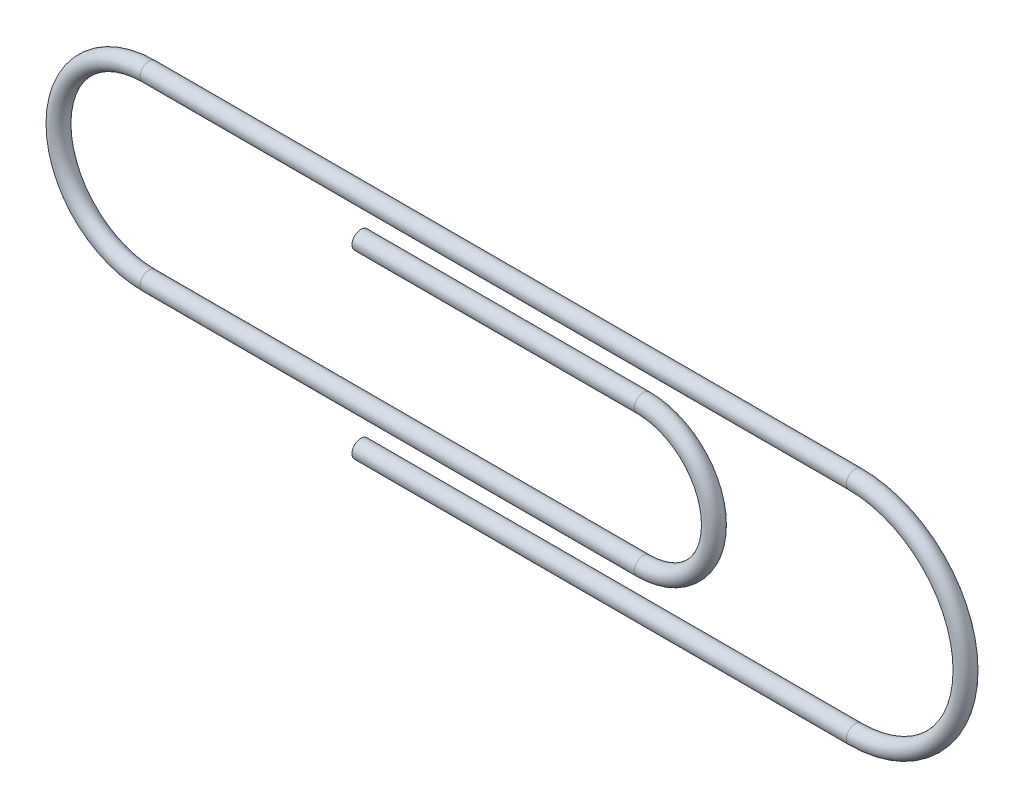
ISO-10303-21;
HEADER;
FILE_DESCRIPTION(('STEP AP214'),'2;1');
FILE_NAME('part.step','',(''),(''),'','','');
FILE_SCHEMA(('AUTOMOTIVE_DESIGN { 1 0 10303 214 1 1 1 1 }'));
ENDSEC;
DATA;
#1=APPLICATION_CONTEXT('core data for automotive mechanical design processes');
#2=APPLICATION_PROTOCOL_DEFINITION('international standard','automotive_design',2000,#1);
#3=PRODUCT_CONTEXT('',#1,'mechanical');
#4=PRODUCT('Part','Part','',(#3));
#5=PRODUCT_RELATED_PRODUCT_CATEGORY('part','',(#4));
#6=PRODUCT_DEFINITION_FORMATION('','',#4);
#7=PRODUCT_DEFINITION_CONTEXT('part definition',#1,'design');
#8=PRODUCT_DEFINITION('design','',#6,#7);
#9=PRODUCT_DEFINITION_SHAPE('','',#8);
#10=(LENGTH_UNIT() NAMED_UNIT(*) SI_UNIT(.MILLI.,.METRE.));
#11=(NAMED_UNIT(*) PLANE_ANGLE_UNIT() SI_UNIT($,.RADIAN.));
#12=(NAMED_UNIT(*) SI_UNIT($,.STERADIAN.) SOLID_ANGLE_UNIT());
#13=UNCERTAINTY_MEASURE_WITH_UNIT(LENGTH_MEASURE(1.E-05),#10,'distance_accuracy_value','');
#14=(GEOMETRIC_REPRESENTATION_CONTEXT(3) GLOBAL_UNCERTAINTY_ASSIGNED_CONTEXT((#13)) GLOBAL_UNIT_ASSIGNED_CONTEXT((#10,
#11,#12)) REPRESENTATION_CONTEXT('',''));
#15=CARTESIAN_POINT('',(0.,0.,0.));
#16=DIRECTION('',(0.,0.,1.));
#17=DIRECTION('',(1.,0.,0.));
#18=AXIS2_PLACEMENT_3D('',#15,#16,#17);
#19=CARTESIAN_POINT('',(14.,-5.125,0.));
#20=DIRECTION('',(-1.,0.,0.));
#21=DIRECTION('',(0.,-1.,0.));
#22=AXIS2_PLACEMENT_3D('',#19,#20,#21);
#23=CYLINDRICAL_SURFACE('',#22,0.25);
#24=CARTESIAN_POINT('',(14.,-5.125,0.));
#25=DIRECTION('',(-1.,0.,0.));
#26=DIRECTION('',(0.,0.,-1.));
#27=AXIS2_PLACEMENT_3D('',#24,#25,#26);
#28=CIRCLE('',#27,0.25);
#29=CARTESIAN_POINT('',(14.,-5.375,0.));
#30=VERTEX_POINT('',#29);
#31=EDGE_CURVE('E37',#30,#30,#28,.T.);
#32=ORIENTED_EDGE('',*,*,#31,.T.);
#33=EDGE_LOOP('',(#32));
#34=FACE_BOUND('',#33,.T.);
#35=CARTESIAN_POINT('',(0.,-5.125,0.));
#36=DIRECTION('',(-1.,0.,0.));
#37=DIRECTION('',(0.,0.,-1.));
#38=AXIS2_PLACEMENT_3D('',#35,#36,#37);
#39=CIRCLE('',#38,0.25);
#40=CARTESIAN_POINT('',(0.,-5.125,-0.25));
#41=VERTEX_POINT('',#40);
#42=EDGE_CURVE('E10',#41,#41,#39,.T.);
#43=ORIENTED_EDGE('',*,*,#42,.F.);
#44=EDGE_LOOP('',(#43));
#45=FACE_BOUND('',#44,.T.);
#46=ADVANCED_FACE('F31',(#34,#45),#23,.T.);
#47=CARTESIAN_POINT('',(14.,-2.,0.));
#48=DIRECTION('',(0.,0.,-1.));
#49=DIRECTION('',(-1.,0.,0.));
#50=AXIS2_PLACEMENT_3D('',#47,#48,#49);
#51=TOROIDAL_SURFACE('',#50,3.125,0.25);
#52=CARTESIAN_POINT('',(14.,1.125,0.));
#53=DIRECTION('',(1.,0.,0.));
#54=DIRECTION('',(0.,0.,-1.));
#55=AXIS2_PLACEMENT_3D('',#52,#53,#54);
#56=CIRCLE('',#55,0.25);
#57=CARTESIAN_POINT('',(14.,1.375,0.));
#58=VERTEX_POINT('',#57);
#59=EDGE_CURVE('E41',#58,#58,#56,.T.);
#60=CARTESIAN_POINT('',(14.,-2.,0.));
#61=DIRECTION('',(0.,0.,-1.));
#62=DIRECTION('',(-1.,0.,0.));
#63=AXIS2_PLACEMENT_3D('',#60,#61,#62);
#64=CIRCLE('',#63,3.375);
#65=EDGE_CURVE('',#58,#30,#64,.T.);
#66=ORIENTED_EDGE('',*,*,#59,.T.);
#67=ORIENTED_EDGE('',*,*,#31,.F.);
#68=ORIENTED_EDGE('',*,*,#65,.T.);
#69=ORIENTED_EDGE('',*,*,#65,.F.);
#70=EDGE_LOOP('',(#66,#68,#67,#69));
#71=FACE_BOUND('',#70,.T.);
#72=ADVANCED_FACE('F81',(#71),#51,.T.);
#73=CARTESIAN_POINT('',(-6.,1.125,0.));
#74=DIRECTION('',(1.,0.,0.));
#75=DIRECTION('',(0.,1.,0.));
#76=AXIS2_PLACEMENT_3D('',#73,#74,#75);
#77=CYLINDRICAL_SURFACE('',#76,0.25);
#78=CARTESIAN_POINT('',(-6.,1.125,0.));
#79=DIRECTION('',(1.,0.,0.));
#80=DIRECTION('',(0.,0.,-1.));
#81=AXIS2_PLACEMENT_3D('',#78,#79,#80);
#82=CIRCLE('',#81,0.25);
#83=CARTESIAN_POINT('',(-6.,1.375,0.));
#84=VERTEX_POINT('',#83);
#85=EDGE_CURVE('E45',#84,#84,#82,.T.);
#86=ORIENTED_EDGE('',*,*,#85,.T.);
#87=EDGE_LOOP('',(#86));
#88=FACE_BOUND('',#87,.T.);
#89=ORIENTED_EDGE('',*,*,#59,.F.);
#90=EDGE_LOOP('',(#89));
#91=FACE_BOUND('',#90,.T.);
#92=ADVANCED_FACE('F85',(#88,#91),#77,.T.);
#93=CARTESIAN_POINT('',(-6.,-1.4375,0.));
#94=DIRECTION('',(0.,0.,-1.));
#95=DIRECTION('',(-1.,0.,0.));
#96=AXIS2_PLACEMENT_3D('',#93,#94,#95);
#97=TOROIDAL_SURFACE('',#96,2.5625,0.25);
#98=CARTESIAN_POINT('',(-6.,-4.,0.));
#99=DIRECTION('',(-1.,0.,0.));
#100=DIRECTION('',(0.,0.,-1.));
#101=AXIS2_PLACEMENT_3D('',#98,#99,#100);
#102=CIRCLE('',#101,0.25);
#103=CARTESIAN_POINT('',(-6.,-4.25,0.));
#104=VERTEX_POINT('',#103);
#105=EDGE_CURVE('E50',#104,#104,#102,.T.);
#106=CARTESIAN_POINT('',(-6.,-1.4375,0.));
#107=DIRECTION('',(0.,0.,-1.));
#108=DIRECTION('',(-1.,0.,0.));
#109=AXIS2_PLACEMENT_3D('',#106,#107,#108);
#110=CIRCLE('',#109,2.8125);
#111=EDGE_CURVE('',#104,#84,#110,.T.);
#112=ORIENTED_EDGE('',*,*,#105,.T.);
#113=ORIENTED_EDGE('',*,*,#85,.F.);
#114=ORIENTED_EDGE('',*,*,#111,.T.);
#115=ORIENTED_EDGE('',*,*,#111,.F.);
#116=EDGE_LOOP('',(#112,#114,#113,#115));
#117=FACE_BOUND('',#116,.T.);
#118=ADVANCED_FACE('F91',(#117),#97,.T.);
#119=CARTESIAN_POINT('',(8.,-4.,0.));
#120=DIRECTION('',(-1.,0.,0.));
#121=DIRECTION('',(0.,-1.,0.));
#122=AXIS2_PLACEMENT_3D('',#119,#120,#121);
#123=CYLINDRICAL_SURFACE('',#122,0.25);
#124=CARTESIAN_POINT('',(8.,-4.,0.));
#125=DIRECTION('',(-1.,0.,0.));
#126=DIRECTION('',(0.,0.,-1.));
#127=AXIS2_PLACEMENT_3D('',#124,#125,#126);
#128=CIRCLE('',#127,0.25);
#129=CARTESIAN_POINT('',(8.,-4.25,0.));
#130=VERTEX_POINT('',#129);
#131=EDGE_CURVE('E53',#130,#130,#128,.T.);
#132=ORIENTED_EDGE('',*,*,#131,.T.);
#133=EDGE_LOOP('',(#132));
#134=FACE_BOUND('',#133,.T.);
#135=ORIENTED_EDGE('',*,*,#105,.F.);
#136=EDGE_LOOP('',(#135));
#137=FACE_BOUND('',#136,.T.);
#138=ADVANCED_FACE('F98',(#134,#137),#123,.T.);
#139=CARTESIAN_POINT('',(8.,-2.,0.));
#140=DIRECTION('',(0.,0.,-1.));
#141=DIRECTION('',(-1.,0.,0.));
#142=AXIS2_PLACEMENT_3D('',#139,#140,#141);
#143=TOROIDAL_SURFACE('',#142,2.,0.25);
#144=CARTESIAN_POINT('',(8.,0.,0.));
#145=DIRECTION('',(1.,0.,0.));
#146=DIRECTION('',(0.,0.,-1.));
#147=AXIS2_PLACEMENT_3D('',#144,#145,#146);
#148=CIRCLE('',#147,0.25);
#149=CARTESIAN_POINT('',(8.,0.25,0.));
#150=VERTEX_POINT('',#149);
#151=EDGE_CURVE('E56',#150,#150,#148,.T.);
#152=CARTESIAN_POINT('',(8.,-2.,0.));
#153=DIRECTION('',(0.,0.,-1.));
#154=DIRECTION('',(-1.,0.,0.));
#155=AXIS2_PLACEMENT_3D('',#152,#153,#154);
#156=CIRCLE('',#155,2.25);
#157=EDGE_CURVE('',#150,#130,#156,.T.);
#158=ORIENTED_EDGE('',*,*,#151,.T.);
#159=ORIENTED_EDGE('',*,*,#131,.F.);
#160=ORIENTED_EDGE('',*,*,#157,.T.);
#161=ORIENTED_EDGE('',*,*,#157,.F.);
#162=EDGE_LOOP('',(#158,#160,#159,#161));
#163=FACE_BOUND('',#162,.T.);
#164=ADVANCED_FACE('F63',(#163),#143,.T.);
#165=CARTESIAN_POINT('',(8.,0.,0.));
#166=DIRECTION('',(-1.,0.,0.));
#167=DIRECTION('',(0.,0.,1.));
#168=AXIS2_PLACEMENT_3D('',#165,#166,#167);
#169=CYLINDRICAL_SURFACE('',#168,0.25);
#170=ORIENTED_EDGE('',*,*,#151,.F.);
#171=EDGE_LOOP('',(#170));
#172=FACE_BOUND('',#171,.T.);
#173=CARTESIAN_POINT('',(0.,0.,0.));
#174=DIRECTION('',(1.,0.,0.));
#175=DIRECTION('',(0.,0.,-1.));
#176=AXIS2_PLACEMENT_3D('',#173,#174,#175);
#177=CIRCLE('',#176,0.25);
#178=CARTESIAN_POINT('',(0.,0.,-0.25));
#179=VERTEX_POINT('',#178);
#180=EDGE_CURVE('E57',#179,#179,#177,.T.);
#181=ORIENTED_EDGE('',*,*,#180,.T.);
#182=EDGE_LOOP('',(#181));
#183=FACE_BOUND('',#182,.T.);
#184=ADVANCED_FACE('F66',(#172,#183),#169,.T.);
#185=CARTESIAN_POINT('',(0.,-5.125,0.));
#186=DIRECTION('',(-1.,0.,0.));
#187=DIRECTION('',(0.,0.,-1.));
#188=AXIS2_PLACEMENT_3D('',#185,#186,#187);
#189=PLANE('',#188);
#190=ORIENTED_EDGE('',*,*,#42,.T.);
#191=EDGE_LOOP('',(#190));
#192=FACE_BOUND('',#191,.T.);
#193=ADVANCED_FACE('F69',(#192),#189,.T.);
#194=CARTESIAN_POINT('',(0.,0.,0.));
#195=DIRECTION('',(1.,0.,0.));
#196=DIRECTION('',(0.,0.,-1.));
#197=AXIS2_PLACEMENT_3D('',#194,#195,#196);
#198=PLANE('',#197);
#199=ORIENTED_EDGE('',*,*,#180,.F.);
#200=EDGE_LOOP('',(#199));
#201=FACE_BOUND('',#200,.T.);
#202=ADVANCED_FACE('F73',(#201),#198,.F.);
#203=CLOSED_SHELL('',(#46,#72,#92,#118,#138,#164,#184,#193,#202));
#204=MANIFOLD_SOLID_BREP('B2',#203);
#205=ADVANCED_BREP_SHAPE_REPRESENTATION('',(#18,#204),#14);
#206=SHAPE_DEFINITION_REPRESENTATION(#9,#205);
ENDSEC;
END-ISO-10303-21;
